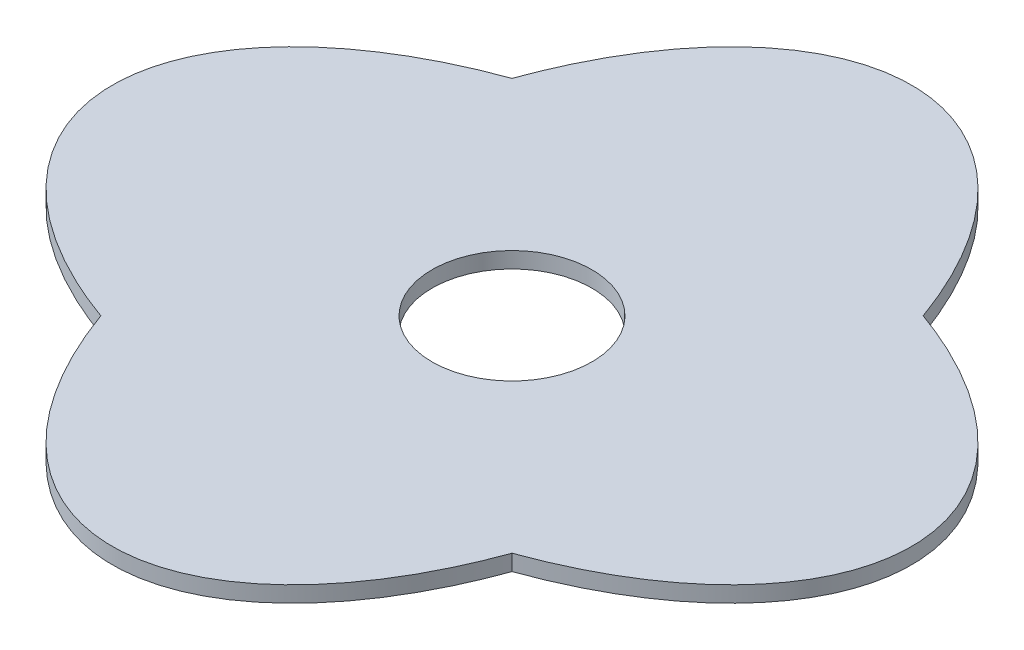
ISO-10303-21;
HEADER;
FILE_DESCRIPTION(('STEP AP214'),'2;1');
FILE_NAME('part.step','',(''),(''),'','','');
FILE_SCHEMA(('AUTOMOTIVE_DESIGN { 1 0 10303 214 1 1 1 1 }'));
ENDSEC;
DATA;
#1=APPLICATION_CONTEXT('core data for automotive mechanical design processes');
#2=APPLICATION_PROTOCOL_DEFINITION('international standard','automotive_design',2000,#1);
#3=PRODUCT_CONTEXT('',#1,'mechanical');
#4=PRODUCT('Part','Part','',(#3));
#5=PRODUCT_RELATED_PRODUCT_CATEGORY('part','',(#4));
#6=PRODUCT_DEFINITION_FORMATION('','',#4);
#7=PRODUCT_DEFINITION_CONTEXT('part definition',#1,'design');
#8=PRODUCT_DEFINITION('design','',#6,#7);
#9=PRODUCT_DEFINITION_SHAPE('','',#8);
#10=(LENGTH_UNIT() NAMED_UNIT(*) SI_UNIT(.MILLI.,.METRE.));
#11=(NAMED_UNIT(*) PLANE_ANGLE_UNIT() SI_UNIT($,.RADIAN.));
#12=(NAMED_UNIT(*) SI_UNIT($,.STERADIAN.) SOLID_ANGLE_UNIT());
#13=UNCERTAINTY_MEASURE_WITH_UNIT(LENGTH_MEASURE(1.E-05),#10,'distance_accuracy_value','');
#14=(GEOMETRIC_REPRESENTATION_CONTEXT(3) GLOBAL_UNCERTAINTY_ASSIGNED_CONTEXT((#13)) GLOBAL_UNIT_ASSIGNED_CONTEXT((#10,
#11,#12)) REPRESENTATION_CONTEXT('',''));
#15=CARTESIAN_POINT('',(0.,0.,0.));
#16=DIRECTION('',(0.,0.,1.));
#17=DIRECTION('',(1.,0.,0.));
#18=AXIS2_PLACEMENT_3D('',#15,#16,#17);
#19=CARTESIAN_POINT('',(0.,2.,0.));
#20=DIRECTION('',(0.,1.,0.));
#21=DIRECTION('',(0.,0.,1.));
#22=AXIS2_PLACEMENT_3D('',#19,#20,#21);
#23=ELLIPSE('',#22,50.,30.);
#24=DIRECTION('',(0.,-1.,0.));
#25=VECTOR('',#24,1.);
#26=SURFACE_OF_LINEAR_EXTRUSION('',#23,#25);
#27=DIRECTION('',(0.,-1.,0.));
#28=VECTOR('',#27,1.);
#29=CARTESIAN_POINT('',(25.7247877713763,2.,-25.7247877713763));
#30=LINE('',#29,#28);
#31=CARTESIAN_POINT('',(25.7247877713763,0.,-25.7247877713763));
#32=VERTEX_POINT('',#31);
#33=CARTESIAN_POINT('',(25.7247877713763,2.,-25.7247877713763));
#34=VERTEX_POINT('',#33);
#35=EDGE_CURVE('E12',#32,#34,#30,.F.);
#36=ORIENTED_EDGE('',*,*,#35,.F.);
#37=CARTESIAN_POINT('',(0.,0.,0.));
#38=DIRECTION('',(0.,1.,0.));
#39=DIRECTION('',(0.,0.,1.));
#40=AXIS2_PLACEMENT_3D('',#37,#38,#39);
#41=ELLIPSE('',#40,50.,30.);
#42=CARTESIAN_POINT('',(-25.7247877713763,0.,-25.7247877713763));
#43=VERTEX_POINT('',#42);
#44=EDGE_CURVE('E96',#32,#43,#41,.T.);
#45=ORIENTED_EDGE('',*,*,#44,.T.);
#46=DIRECTION('',(0.,-1.,0.));
#47=VECTOR('',#46,1.);
#48=CARTESIAN_POINT('',(-25.7247877713763,2.,-25.7247877713763));
#49=LINE('',#48,#47);
#50=CARTESIAN_POINT('',(-25.7247877713763,2.,-25.7247877713763));
#51=VERTEX_POINT('',#50);
#52=EDGE_CURVE('E47',#51,#43,#49,.T.);
#53=ORIENTED_EDGE('',*,*,#52,.F.);
#54=EDGE_CURVE('E89',#34,#51,#23,.T.);
#55=ORIENTED_EDGE('',*,*,#54,.F.);
#56=EDGE_LOOP('',(#36,#45,#53,#55));
#57=FACE_BOUND('',#56,.T.);
#58=ADVANCED_FACE('F38',(#57),#26,.F.);
#59=CARTESIAN_POINT('',(0.,0.,0.));
#60=DIRECTION('',(0.,1.,0.));
#61=DIRECTION('',(0.,0.,1.));
#62=AXIS2_PLACEMENT_3D('',#59,#60,#61);
#63=PLANE('',#62);
#64=CARTESIAN_POINT('',(0.,0.,0.));
#65=DIRECTION('',(0.,1.,0.));
#66=DIRECTION('',(0.,0.,1.));
#67=AXIS2_PLACEMENT_3D('',#64,#65,#66);
#68=CIRCLE('',#67,10.);
#69=CARTESIAN_POINT('',(0.,0.,10.));
#70=VERTEX_POINT('',#69);
#71=EDGE_CURVE('E172',#70,#70,#68,.T.);
#72=ORIENTED_EDGE('',*,*,#71,.T.);
#73=EDGE_LOOP('',(#72));
#74=FACE_BOUND('',#73,.T.);
#75=ORIENTED_EDGE('',*,*,#44,.F.);
#76=CARTESIAN_POINT('',(0.,0.,0.));
#77=DIRECTION('',(0.,1.,0.));
#78=DIRECTION('',(1.,0.,0.));
#79=AXIS2_PLACEMENT_3D('',#76,#77,#78);
#80=ELLIPSE('',#79,50.,30.);
#81=CARTESIAN_POINT('',(25.7247877713763,0.,25.7247877713763));
#82=VERTEX_POINT('',#81);
#83=EDGE_CURVE('E81',#82,#32,#80,.T.);
#84=ORIENTED_EDGE('',*,*,#83,.F.);
#85=CARTESIAN_POINT('',(-25.7247877713763,0.,25.7247877713763));
#86=VERTEX_POINT('',#85);
#87=EDGE_CURVE('E95',#86,#82,#41,.T.);
#88=ORIENTED_EDGE('',*,*,#87,.F.);
#89=EDGE_CURVE('E97',#43,#86,#80,.T.);
#90=ORIENTED_EDGE('',*,*,#89,.F.);
#91=EDGE_LOOP('',(#75,#84,#88,#90));
#92=FACE_BOUND('',#91,.T.);
#93=ADVANCED_FACE('F93',(#74,#92),#63,.F.);
#94=CARTESIAN_POINT('',(0.,2.,0.));
#95=DIRECTION('',(0.,1.,0.));
#96=DIRECTION('',(0.,0.,1.));
#97=AXIS2_PLACEMENT_3D('',#94,#95,#96);
#98=PLANE('',#97);
#99=CARTESIAN_POINT('',(0.,2.,0.));
#100=DIRECTION('',(0.,1.,0.));
#101=DIRECTION('',(0.,0.,1.));
#102=AXIS2_PLACEMENT_3D('',#99,#100,#101);
#103=CIRCLE('',#102,10.);
#104=CARTESIAN_POINT('',(0.,2.,10.));
#105=VERTEX_POINT('',#104);
#106=EDGE_CURVE('E98',#105,#105,#103,.T.);
#107=ORIENTED_EDGE('',*,*,#106,.F.);
#108=EDGE_LOOP('',(#107));
#109=FACE_BOUND('',#108,.T.);
#110=ORIENTED_EDGE('',*,*,#54,.T.);
#111=CARTESIAN_POINT('',(0.,2.,0.));
#112=DIRECTION('',(0.,1.,0.));
#113=DIRECTION('',(1.,0.,0.));
#114=AXIS2_PLACEMENT_3D('',#111,#112,#113);
#115=ELLIPSE('',#114,50.,30.);
#116=CARTESIAN_POINT('',(-25.7247877713763,2.,25.7247877713763));
#117=VERTEX_POINT('',#116);
#118=EDGE_CURVE('E101',#51,#117,#115,.T.);
#119=ORIENTED_EDGE('',*,*,#118,.T.);
#120=CARTESIAN_POINT('',(25.7247877713763,2.,25.7247877713763));
#121=VERTEX_POINT('',#120);
#122=EDGE_CURVE('E103',#117,#121,#23,.T.);
#123=ORIENTED_EDGE('',*,*,#122,.T.);
#124=EDGE_CURVE('E84',#121,#34,#115,.T.);
#125=ORIENTED_EDGE('',*,*,#124,.T.);
#126=EDGE_LOOP('',(#110,#119,#123,#125));
#127=FACE_BOUND('',#126,.T.);
#128=ADVANCED_FACE('F112',(#109,#127),#98,.T.);
#129=DIRECTION('',(0.,-1.,0.));
#130=VECTOR('',#129,1.);
#131=CARTESIAN_POINT('',(-25.7247877713763,2.,25.7247877713763));
#132=LINE('',#131,#130);
#133=EDGE_CURVE('E54',#86,#117,#132,.F.);
#134=ORIENTED_EDGE('',*,*,#133,.F.);
#135=ORIENTED_EDGE('',*,*,#87,.T.);
#136=DIRECTION('',(0.,-1.,0.));
#137=VECTOR('',#136,1.);
#138=CARTESIAN_POINT('',(25.7247877713763,2.,25.7247877713763));
#139=LINE('',#138,#137);
#140=EDGE_CURVE('E79',#121,#82,#139,.T.);
#141=ORIENTED_EDGE('',*,*,#140,.F.);
#142=ORIENTED_EDGE('',*,*,#122,.F.);
#143=EDGE_LOOP('',(#134,#135,#141,#142));
#144=FACE_BOUND('',#143,.T.);
#145=ADVANCED_FACE('F100',(#144),#26,.F.);
#146=DIRECTION('',(0.,-1.,0.));
#147=VECTOR('',#146,1.);
#148=SURFACE_OF_LINEAR_EXTRUSION('',#115,#147);
#149=ORIENTED_EDGE('',*,*,#118,.F.);
#150=ORIENTED_EDGE('',*,*,#52,.T.);
#151=ORIENTED_EDGE('',*,*,#89,.T.);
#152=ORIENTED_EDGE('',*,*,#133,.T.);
#153=EDGE_LOOP('',(#149,#150,#151,#152));
#154=FACE_BOUND('',#153,.T.);
#155=ADVANCED_FACE('F109',(#154),#148,.F.);
#156=ORIENTED_EDGE('',*,*,#83,.T.);
#157=ORIENTED_EDGE('',*,*,#35,.T.);
#158=ORIENTED_EDGE('',*,*,#124,.F.);
#159=ORIENTED_EDGE('',*,*,#140,.T.);
#160=EDGE_LOOP('',(#156,#157,#158,#159));
#161=FACE_BOUND('',#160,.T.);
#162=ADVANCED_FACE('F40',(#161),#148,.F.);
#163=CARTESIAN_POINT('',(0.,2.001,0.));
#164=DIRECTION('',(0.,-1.,0.));
#165=DIRECTION('',(0.,0.,-1.));
#166=AXIS2_PLACEMENT_3D('',#163,#164,#165);
#167=CYLINDRICAL_SURFACE('',#166,10.);
#168=ORIENTED_EDGE('',*,*,#106,.T.);
#169=EDGE_LOOP('',(#168));
#170=FACE_BOUND('',#169,.T.);
#171=ORIENTED_EDGE('',*,*,#71,.F.);
#172=EDGE_LOOP('',(#171));
#173=FACE_BOUND('',#172,.T.);
#174=ADVANCED_FACE('F147',(#170,#173),#167,.F.);
#175=CLOSED_SHELL('',(#58,#93,#128,#145,#155,#162,#174));
#176=MANIFOLD_SOLID_BREP('B2',#175);
#177=ADVANCED_BREP_SHAPE_REPRESENTATION('',(#18,#176),#14);
#178=SHAPE_DEFINITION_REPRESENTATION(#9,#177);
ENDSEC;
END-ISO-10303-21;
